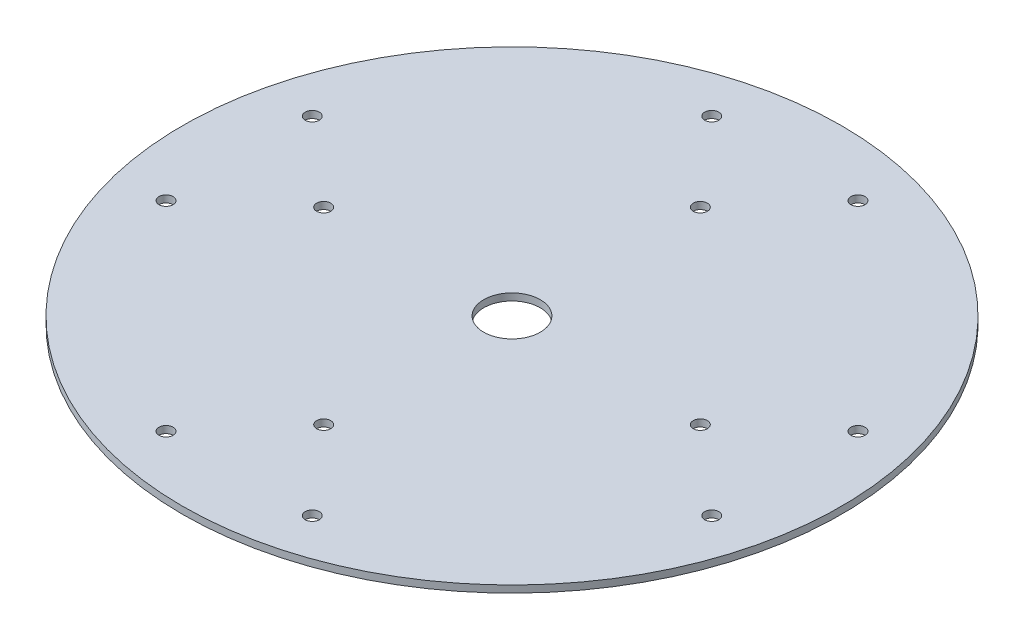
ISO-10303-21;
HEADER;
FILE_DESCRIPTION(('STEP AP214'),'2;1');
FILE_NAME('part.step','',(''),(''),'','','');
FILE_SCHEMA(('AUTOMOTIVE_DESIGN { 1 0 10303 214 1 1 1 1 }'));
ENDSEC;
DATA;
#1=APPLICATION_CONTEXT('core data for automotive mechanical design processes');
#2=APPLICATION_PROTOCOL_DEFINITION('international standard','automotive_design',2000,#1);
#3=PRODUCT_CONTEXT('',#1,'mechanical');
#4=PRODUCT('Part','Part','',(#3));
#5=PRODUCT_RELATED_PRODUCT_CATEGORY('part','',(#4));
#6=PRODUCT_DEFINITION_FORMATION('','',#4);
#7=PRODUCT_DEFINITION_CONTEXT('part definition',#1,'design');
#8=PRODUCT_DEFINITION('design','',#6,#7);
#9=PRODUCT_DEFINITION_SHAPE('','',#8);
#10=(LENGTH_UNIT() NAMED_UNIT(*) SI_UNIT(.MILLI.,.METRE.));
#11=(NAMED_UNIT(*) PLANE_ANGLE_UNIT() SI_UNIT($,.RADIAN.));
#12=(NAMED_UNIT(*) SI_UNIT($,.STERADIAN.) SOLID_ANGLE_UNIT());
#13=UNCERTAINTY_MEASURE_WITH_UNIT(LENGTH_MEASURE(1.E-05),#10,'distance_accuracy_value','');
#14=(GEOMETRIC_REPRESENTATION_CONTEXT(3) GLOBAL_UNCERTAINTY_ASSIGNED_CONTEXT((#13)) GLOBAL_UNIT_ASSIGNED_CONTEXT((#10,
#11,#12)) REPRESENTATION_CONTEXT('',''));
#15=CARTESIAN_POINT('',(0.,0.,0.));
#16=DIRECTION('',(0.,0.,1.));
#17=DIRECTION('',(1.,0.,0.));
#18=AXIS2_PLACEMENT_3D('',#15,#16,#17);
#19=CARTESIAN_POINT('',(0.,1.5,0.));
#20=DIRECTION('',(0.,1.,0.));
#21=DIRECTION('',(0.,0.,1.));
#22=AXIS2_PLACEMENT_3D('',#19,#20,#21);
#23=PLANE('',#22);
#24=CARTESIAN_POINT('',(-57.9555495773429,1.5,15.5291427061524));
#25=DIRECTION('',(0.,1.,0.));
#26=DIRECTION('',(0.,0.,1.));
#27=AXIS2_PLACEMENT_3D('',#24,#25,#26);
#28=CIRCLE('',#27,1.5);
#29=CARTESIAN_POINT('',(-57.9555495773429,1.5,17.0291427061524));
#30=VERTEX_POINT('',#29);
#31=EDGE_CURVE('E141',#30,#30,#28,.T.);
#32=ORIENTED_EDGE('',*,*,#31,.F.);
#33=EDGE_LOOP('',(#32));
#34=FACE_BOUND('',#33,.T.);
#35=CARTESIAN_POINT('',(-15.5291427061486,1.5,57.9555495773442));
#36=DIRECTION('',(0.,1.,0.));
#37=DIRECTION('',(0.,0.,1.));
#38=AXIS2_PLACEMENT_3D('',#35,#36,#37);
#39=CIRCLE('',#38,1.5);
#40=CARTESIAN_POINT('',(-15.5291427061486,1.5,59.4555495773442));
#41=VERTEX_POINT('',#40);
#42=EDGE_CURVE('E125',#41,#41,#39,.T.);
#43=ORIENTED_EDGE('',*,*,#42,.F.);
#44=EDGE_LOOP('',(#43));
#45=FACE_BOUND('',#44,.T.);
#46=CARTESIAN_POINT('',(2.25904099284255E-12,1.5,40.));
#47=DIRECTION('',(0.,1.,0.));
#48=DIRECTION('',(0.,0.,1.));
#49=AXIS2_PLACEMENT_3D('',#46,#47,#48);
#50=CIRCLE('',#49,1.5);
#51=CARTESIAN_POINT('',(2.25904099284255E-12,1.5,41.5));
#52=VERTEX_POINT('',#51);
#53=EDGE_CURVE('E109',#52,#52,#50,.T.);
#54=ORIENTED_EDGE('',*,*,#53,.F.);
#55=EDGE_LOOP('',(#54));
#56=FACE_BOUND('',#55,.T.);
#57=CARTESIAN_POINT('',(57.9555495773452,1.5,-15.5291427061524));
#58=DIRECTION('',(0.,1.,0.));
#59=DIRECTION('',(0.,0.,1.));
#60=AXIS2_PLACEMENT_3D('',#57,#58,#59);
#61=CIRCLE('',#60,1.5);
#62=CARTESIAN_POINT('',(57.9555495773452,1.5,-14.0291427061524));
#63=VERTEX_POINT('',#62);
#64=EDGE_CURVE('E93',#63,#63,#61,.T.);
#65=ORIENTED_EDGE('',*,*,#64,.F.);
#66=EDGE_LOOP('',(#65));
#67=FACE_BOUND('',#66,.T.);
#68=CARTESIAN_POINT('',(15.5291427061509,1.5,-57.9555495773442));
#69=DIRECTION('',(0.,1.,0.));
#70=DIRECTION('',(0.,0.,1.));
#71=AXIS2_PLACEMENT_3D('',#68,#69,#70);
#72=CIRCLE('',#71,1.5);
#73=CARTESIAN_POINT('',(15.5291427061509,1.5,-56.4555495773442));
#74=VERTEX_POINT('',#73);
#75=EDGE_CURVE('E77',#74,#74,#72,.T.);
#76=ORIENTED_EDGE('',*,*,#75,.F.);
#77=EDGE_LOOP('',(#76));
#78=FACE_BOUND('',#77,.T.);
#79=CARTESIAN_POINT('',(0.,1.5,-40.));
#80=DIRECTION('',(0.,1.,0.));
#81=DIRECTION('',(0.,0.,1.));
#82=AXIS2_PLACEMENT_3D('',#79,#80,#81);
#83=CIRCLE('',#82,1.5);
#84=CARTESIAN_POINT('',(0.,1.5,-38.5));
#85=VERTEX_POINT('',#84);
#86=EDGE_CURVE('E61',#85,#85,#83,.T.);
#87=ORIENTED_EDGE('',*,*,#86,.F.);
#88=EDGE_LOOP('',(#87));
#89=FACE_BOUND('',#88,.T.);
#90=CARTESIAN_POINT('',(0.,1.5,0.));
#91=DIRECTION('',(0.,1.,0.));
#92=DIRECTION('',(0.,0.,1.));
#93=AXIS2_PLACEMENT_3D('',#90,#91,#92);
#94=CIRCLE('',#93,70.);
#95=CARTESIAN_POINT('',(0.,1.5,70.));
#96=VERTEX_POINT('',#95);
#97=EDGE_CURVE('E10',#96,#96,#94,.T.);
#98=ORIENTED_EDGE('',*,*,#97,.T.);
#99=EDGE_LOOP('',(#98));
#100=FACE_BOUND('',#99,.T.);
#101=CARTESIAN_POINT('',(0.,1.5,0.));
#102=DIRECTION('',(0.,1.,0.));
#103=DIRECTION('',(0.,0.,1.));
#104=AXIS2_PLACEMENT_3D('',#101,#102,#103);
#105=CIRCLE('',#104,6.);
#106=CARTESIAN_POINT('',(0.,1.5,6.));
#107=VERTEX_POINT('',#106);
#108=EDGE_CURVE('E55',#107,#107,#105,.T.);
#109=ORIENTED_EDGE('',*,*,#108,.F.);
#110=EDGE_LOOP('',(#109));
#111=FACE_BOUND('',#110,.T.);
#112=CARTESIAN_POINT('',(-15.5291427061513,1.5,-57.9555495773441));
#113=DIRECTION('',(0.,1.,0.));
#114=DIRECTION('',(0.,0.,1.));
#115=AXIS2_PLACEMENT_3D('',#112,#113,#114);
#116=CIRCLE('',#115,1.5);
#117=CARTESIAN_POINT('',(-15.5291427061513,1.5,-56.4555495773441));
#118=VERTEX_POINT('',#117);
#119=EDGE_CURVE('E69',#118,#118,#116,.T.);
#120=ORIENTED_EDGE('',*,*,#119,.F.);
#121=EDGE_LOOP('',(#120));
#122=FACE_BOUND('',#121,.T.);
#123=CARTESIAN_POINT('',(40.0000000000011,1.5,-1.12952049642128E-12));
#124=DIRECTION('',(0.,1.,0.));
#125=DIRECTION('',(0.,0.,1.));
#126=AXIS2_PLACEMENT_3D('',#123,#124,#125);
#127=CIRCLE('',#126,1.5);
#128=CARTESIAN_POINT('',(40.0000000000011,1.5,1.49999999999887));
#129=VERTEX_POINT('',#128);
#130=EDGE_CURVE('E85',#129,#129,#127,.T.);
#131=ORIENTED_EDGE('',*,*,#130,.F.);
#132=EDGE_LOOP('',(#131));
#133=FACE_BOUND('',#132,.T.);
#134=CARTESIAN_POINT('',(57.9555495773453,1.5,15.5291427061497));
#135=DIRECTION('',(0.,1.,0.));
#136=DIRECTION('',(0.,0.,1.));
#137=AXIS2_PLACEMENT_3D('',#134,#135,#136);
#138=CIRCLE('',#137,1.5);
#139=CARTESIAN_POINT('',(57.9555495773453,1.5,17.0291427061497));
#140=VERTEX_POINT('',#139);
#141=EDGE_CURVE('E101',#140,#140,#138,.T.);
#142=ORIENTED_EDGE('',*,*,#141,.F.);
#143=EDGE_LOOP('',(#142));
#144=FACE_BOUND('',#143,.T.);
#145=CARTESIAN_POINT('',(15.5291427061536,1.5,57.9555495773441));
#146=DIRECTION('',(0.,1.,0.));
#147=DIRECTION('',(0.,0.,1.));
#148=AXIS2_PLACEMENT_3D('',#145,#146,#147);
#149=CIRCLE('',#148,1.5);
#150=CARTESIAN_POINT('',(15.5291427061536,1.5,59.4555495773441));
#151=VERTEX_POINT('',#150);
#152=EDGE_CURVE('E117',#151,#151,#149,.T.);
#153=ORIENTED_EDGE('',*,*,#152,.F.);
#154=EDGE_LOOP('',(#153));
#155=FACE_BOUND('',#154,.T.);
#156=CARTESIAN_POINT('',(-39.9999999999989,1.5,1.13441908361787E-12));
#157=DIRECTION('',(0.,1.,0.));
#158=DIRECTION('',(0.,0.,1.));
#159=AXIS2_PLACEMENT_3D('',#156,#157,#158);
#160=CIRCLE('',#159,1.5);
#161=CARTESIAN_POINT('',(-39.9999999999989,1.5,1.50000000000114));
#162=VERTEX_POINT('',#161);
#163=EDGE_CURVE('E133',#162,#162,#160,.T.);
#164=ORIENTED_EDGE('',*,*,#163,.F.);
#165=EDGE_LOOP('',(#164));
#166=FACE_BOUND('',#165,.T.);
#167=CARTESIAN_POINT('',(-57.9555495773431,1.5,-15.5291427061497));
#168=DIRECTION('',(0.,1.,0.));
#169=DIRECTION('',(0.,0.,1.));
#170=AXIS2_PLACEMENT_3D('',#167,#168,#169);
#171=CIRCLE('',#170,1.5);
#172=CARTESIAN_POINT('',(-57.9555495773431,1.5,-14.0291427061497));
#173=VERTEX_POINT('',#172);
#174=EDGE_CURVE('E149',#173,#173,#171,.T.);
#175=ORIENTED_EDGE('',*,*,#174,.F.);
#176=EDGE_LOOP('',(#175));
#177=FACE_BOUND('',#176,.T.);
#178=ADVANCED_FACE('F41',(#34,#45,#56,#67,#78,#89,#100,#111,#122,#133,#144,#155,#166,#177),#23,.T.);
#179=CARTESIAN_POINT('',(0.,0.,0.));
#180=DIRECTION('',(0.,1.,0.));
#181=DIRECTION('',(0.,0.,1.));
#182=AXIS2_PLACEMENT_3D('',#179,#180,#181);
#183=PLANE('',#182);
#184=CARTESIAN_POINT('',(0.,0.,0.));
#185=DIRECTION('',(0.,1.,0.));
#186=DIRECTION('',(0.,0.,1.));
#187=AXIS2_PLACEMENT_3D('',#184,#185,#186);
#188=CIRCLE('',#187,70.);
#189=CARTESIAN_POINT('',(0.,0.,70.));
#190=VERTEX_POINT('',#189);
#191=EDGE_CURVE('E45',#190,#190,#188,.T.);
#192=ORIENTED_EDGE('',*,*,#191,.F.);
#193=EDGE_LOOP('',(#192));
#194=FACE_BOUND('',#193,.T.);
#195=CARTESIAN_POINT('',(0.,0.,0.));
#196=DIRECTION('',(0.,1.,0.));
#197=DIRECTION('',(0.,0.,1.));
#198=AXIS2_PLACEMENT_3D('',#195,#196,#197);
#199=CIRCLE('',#198,6.);
#200=CARTESIAN_POINT('',(0.,0.,6.));
#201=VERTEX_POINT('',#200);
#202=EDGE_CURVE('E57',#201,#201,#199,.T.);
#203=ORIENTED_EDGE('',*,*,#202,.T.);
#204=EDGE_LOOP('',(#203));
#205=FACE_BOUND('',#204,.T.);
#206=CARTESIAN_POINT('',(0.,0.,-40.));
#207=DIRECTION('',(0.,1.,0.));
#208=DIRECTION('',(0.,0.,1.));
#209=AXIS2_PLACEMENT_3D('',#206,#207,#208);
#210=CIRCLE('',#209,1.5);
#211=CARTESIAN_POINT('',(0.,0.,-38.5));
#212=VERTEX_POINT('',#211);
#213=EDGE_CURVE('E65',#212,#212,#210,.T.);
#214=ORIENTED_EDGE('',*,*,#213,.T.);
#215=EDGE_LOOP('',(#214));
#216=FACE_BOUND('',#215,.T.);
#217=CARTESIAN_POINT('',(-15.5291427061513,0.,-57.9555495773441));
#218=DIRECTION('',(0.,1.,0.));
#219=DIRECTION('',(0.,0.,1.));
#220=AXIS2_PLACEMENT_3D('',#217,#218,#219);
#221=CIRCLE('',#220,1.5);
#222=CARTESIAN_POINT('',(-15.5291427061513,0.,-56.4555495773441));
#223=VERTEX_POINT('',#222);
#224=EDGE_CURVE('E73',#223,#223,#221,.T.);
#225=ORIENTED_EDGE('',*,*,#224,.T.);
#226=EDGE_LOOP('',(#225));
#227=FACE_BOUND('',#226,.T.);
#228=CARTESIAN_POINT('',(15.5291427061509,0.,-57.9555495773442));
#229=DIRECTION('',(0.,1.,0.));
#230=DIRECTION('',(0.,0.,1.));
#231=AXIS2_PLACEMENT_3D('',#228,#229,#230);
#232=CIRCLE('',#231,1.5);
#233=CARTESIAN_POINT('',(15.5291427061509,0.,-56.4555495773442));
#234=VERTEX_POINT('',#233);
#235=EDGE_CURVE('E81',#234,#234,#232,.T.);
#236=ORIENTED_EDGE('',*,*,#235,.T.);
#237=EDGE_LOOP('',(#236));
#238=FACE_BOUND('',#237,.T.);
#239=CARTESIAN_POINT('',(40.0000000000011,0.,-1.12952049642128E-12));
#240=DIRECTION('',(0.,1.,0.));
#241=DIRECTION('',(0.,0.,1.));
#242=AXIS2_PLACEMENT_3D('',#239,#240,#241);
#243=CIRCLE('',#242,1.5);
#244=CARTESIAN_POINT('',(40.0000000000011,0.,1.49999999999887));
#245=VERTEX_POINT('',#244);
#246=EDGE_CURVE('E89',#245,#245,#243,.T.);
#247=ORIENTED_EDGE('',*,*,#246,.T.);
#248=EDGE_LOOP('',(#247));
#249=FACE_BOUND('',#248,.T.);
#250=CARTESIAN_POINT('',(57.9555495773452,0.,-15.5291427061524));
#251=DIRECTION('',(0.,1.,0.));
#252=DIRECTION('',(0.,0.,1.));
#253=AXIS2_PLACEMENT_3D('',#250,#251,#252);
#254=CIRCLE('',#253,1.5);
#255=CARTESIAN_POINT('',(57.9555495773452,0.,-14.0291427061524));
#256=VERTEX_POINT('',#255);
#257=EDGE_CURVE('E97',#256,#256,#254,.T.);
#258=ORIENTED_EDGE('',*,*,#257,.T.);
#259=EDGE_LOOP('',(#258));
#260=FACE_BOUND('',#259,.T.);
#261=CARTESIAN_POINT('',(57.9555495773453,0.,15.5291427061497));
#262=DIRECTION('',(0.,1.,0.));
#263=DIRECTION('',(0.,0.,1.));
#264=AXIS2_PLACEMENT_3D('',#261,#262,#263);
#265=CIRCLE('',#264,1.5);
#266=CARTESIAN_POINT('',(57.9555495773453,0.,17.0291427061497));
#267=VERTEX_POINT('',#266);
#268=EDGE_CURVE('E105',#267,#267,#265,.T.);
#269=ORIENTED_EDGE('',*,*,#268,.T.);
#270=EDGE_LOOP('',(#269));
#271=FACE_BOUND('',#270,.T.);
#272=CARTESIAN_POINT('',(2.25904099284255E-12,0.,40.));
#273=DIRECTION('',(0.,1.,0.));
#274=DIRECTION('',(0.,0.,1.));
#275=AXIS2_PLACEMENT_3D('',#272,#273,#274);
#276=CIRCLE('',#275,1.5);
#277=CARTESIAN_POINT('',(2.25904099284255E-12,0.,41.5));
#278=VERTEX_POINT('',#277);
#279=EDGE_CURVE('E113',#278,#278,#276,.T.);
#280=ORIENTED_EDGE('',*,*,#279,.T.);
#281=EDGE_LOOP('',(#280));
#282=FACE_BOUND('',#281,.T.);
#283=CARTESIAN_POINT('',(15.5291427061536,0.,57.9555495773441));
#284=DIRECTION('',(0.,1.,0.));
#285=DIRECTION('',(0.,0.,1.));
#286=AXIS2_PLACEMENT_3D('',#283,#284,#285);
#287=CIRCLE('',#286,1.5);
#288=CARTESIAN_POINT('',(15.5291427061536,0.,59.4555495773441));
#289=VERTEX_POINT('',#288);
#290=EDGE_CURVE('E121',#289,#289,#287,.T.);
#291=ORIENTED_EDGE('',*,*,#290,.T.);
#292=EDGE_LOOP('',(#291));
#293=FACE_BOUND('',#292,.T.);
#294=CARTESIAN_POINT('',(-15.5291427061486,0.,57.9555495773442));
#295=DIRECTION('',(0.,1.,0.));
#296=DIRECTION('',(0.,0.,1.));
#297=AXIS2_PLACEMENT_3D('',#294,#295,#296);
#298=CIRCLE('',#297,1.5);
#299=CARTESIAN_POINT('',(-15.5291427061486,0.,59.4555495773442));
#300=VERTEX_POINT('',#299);
#301=EDGE_CURVE('E129',#300,#300,#298,.T.);
#302=ORIENTED_EDGE('',*,*,#301,.T.);
#303=EDGE_LOOP('',(#302));
#304=FACE_BOUND('',#303,.T.);
#305=CARTESIAN_POINT('',(-39.9999999999989,0.,1.13441908361787E-12));
#306=DIRECTION('',(0.,1.,0.));
#307=DIRECTION('',(0.,0.,1.));
#308=AXIS2_PLACEMENT_3D('',#305,#306,#307);
#309=CIRCLE('',#308,1.5);
#310=CARTESIAN_POINT('',(-39.9999999999989,0.,1.50000000000114));
#311=VERTEX_POINT('',#310);
#312=EDGE_CURVE('E137',#311,#311,#309,.T.);
#313=ORIENTED_EDGE('',*,*,#312,.T.);
#314=EDGE_LOOP('',(#313));
#315=FACE_BOUND('',#314,.T.);
#316=CARTESIAN_POINT('',(-57.9555495773429,0.,15.5291427061524));
#317=DIRECTION('',(0.,1.,0.));
#318=DIRECTION('',(0.,0.,1.));
#319=AXIS2_PLACEMENT_3D('',#316,#317,#318);
#320=CIRCLE('',#319,1.5);
#321=CARTESIAN_POINT('',(-57.9555495773429,0.,17.0291427061524));
#322=VERTEX_POINT('',#321);
#323=EDGE_CURVE('E145',#322,#322,#320,.T.);
#324=ORIENTED_EDGE('',*,*,#323,.T.);
#325=EDGE_LOOP('',(#324));
#326=FACE_BOUND('',#325,.T.);
#327=CARTESIAN_POINT('',(-57.9555495773431,0.,-15.5291427061497));
#328=DIRECTION('',(0.,1.,0.));
#329=DIRECTION('',(0.,0.,1.));
#330=AXIS2_PLACEMENT_3D('',#327,#328,#329);
#331=CIRCLE('',#330,1.5);
#332=CARTESIAN_POINT('',(-57.9555495773431,0.,-14.0291427061497));
#333=VERTEX_POINT('',#332);
#334=EDGE_CURVE('E153',#333,#333,#331,.T.);
#335=ORIENTED_EDGE('',*,*,#334,.T.);
#336=EDGE_LOOP('',(#335));
#337=FACE_BOUND('',#336,.T.);
#338=ADVANCED_FACE('F166',(#194,#205,#216,#227,#238,#249,#260,#271,#282,#293,#304,#315,#326,
#337),#183,.F.);
#339=CARTESIAN_POINT('',(0.,1.5,0.));
#340=DIRECTION('',(0.,-1.,0.));
#341=DIRECTION('',(0.,0.,-1.));
#342=AXIS2_PLACEMENT_3D('',#339,#340,#341);
#343=CYLINDRICAL_SURFACE('',#342,70.);
#344=ORIENTED_EDGE('',*,*,#97,.F.);
#345=EDGE_LOOP('',(#344));
#346=FACE_BOUND('',#345,.T.);
#347=ORIENTED_EDGE('',*,*,#191,.T.);
#348=EDGE_LOOP('',(#347));
#349=FACE_BOUND('',#348,.T.);
#350=ADVANCED_FACE('F43',(#346,#349),#343,.T.);
#351=CARTESIAN_POINT('',(0.,1.5,0.));
#352=DIRECTION('',(0.,-1.,0.));
#353=DIRECTION('',(0.,0.,-1.));
#354=AXIS2_PLACEMENT_3D('',#351,#352,#353);
#355=CYLINDRICAL_SURFACE('',#354,6.);
#356=ORIENTED_EDGE('',*,*,#108,.T.);
#357=EDGE_LOOP('',(#356));
#358=FACE_BOUND('',#357,.T.);
#359=ORIENTED_EDGE('',*,*,#202,.F.);
#360=EDGE_LOOP('',(#359));
#361=FACE_BOUND('',#360,.T.);
#362=ADVANCED_FACE('F176',(#358,#361),#355,.F.);
#363=CARTESIAN_POINT('',(0.,1.5,-40.));
#364=DIRECTION('',(0.,-1.,0.));
#365=DIRECTION('',(0.,0.,-1.));
#366=AXIS2_PLACEMENT_3D('',#363,#364,#365);
#367=CYLINDRICAL_SURFACE('',#366,1.5);
#368=ORIENTED_EDGE('',*,*,#86,.T.);
#369=EDGE_LOOP('',(#368));
#370=FACE_BOUND('',#369,.T.);
#371=ORIENTED_EDGE('',*,*,#213,.F.);
#372=EDGE_LOOP('',(#371));
#373=FACE_BOUND('',#372,.T.);
#374=ADVANCED_FACE('F179',(#370,#373),#367,.F.);
#375=CARTESIAN_POINT('',(-15.5291427061513,1.5,-57.9555495773441));
#376=DIRECTION('',(0.,-1.,0.));
#377=DIRECTION('',(0.,0.,-1.));
#378=AXIS2_PLACEMENT_3D('',#375,#376,#377);
#379=CYLINDRICAL_SURFACE('',#378,1.5);
#380=ORIENTED_EDGE('',*,*,#119,.T.);
#381=EDGE_LOOP('',(#380));
#382=FACE_BOUND('',#381,.T.);
#383=ORIENTED_EDGE('',*,*,#224,.F.);
#384=EDGE_LOOP('',(#383));
#385=FACE_BOUND('',#384,.T.);
#386=ADVANCED_FACE('F183',(#382,#385),#379,.F.);
#387=CARTESIAN_POINT('',(15.5291427061509,1.5,-57.9555495773442));
#388=DIRECTION('',(0.,-1.,0.));
#389=DIRECTION('',(0.,0.,-1.));
#390=AXIS2_PLACEMENT_3D('',#387,#388,#389);
#391=CYLINDRICAL_SURFACE('',#390,1.5);
#392=ORIENTED_EDGE('',*,*,#75,.T.);
#393=EDGE_LOOP('',(#392));
#394=FACE_BOUND('',#393,.T.);
#395=ORIENTED_EDGE('',*,*,#235,.F.);
#396=EDGE_LOOP('',(#395));
#397=FACE_BOUND('',#396,.T.);
#398=ADVANCED_FACE('F187',(#394,#397),#391,.F.);
#399=CARTESIAN_POINT('',(40.0000000000011,1.5,-1.12952049642128E-12));
#400=DIRECTION('',(0.,-1.,0.));
#401=DIRECTION('',(0.,0.,-1.));
#402=AXIS2_PLACEMENT_3D('',#399,#400,#401);
#403=CYLINDRICAL_SURFACE('',#402,1.5);
#404=ORIENTED_EDGE('',*,*,#130,.T.);
#405=EDGE_LOOP('',(#404));
#406=FACE_BOUND('',#405,.T.);
#407=ORIENTED_EDGE('',*,*,#246,.F.);
#408=EDGE_LOOP('',(#407));
#409=FACE_BOUND('',#408,.T.);
#410=ADVANCED_FACE('F191',(#406,#409),#403,.F.);
#411=CARTESIAN_POINT('',(57.9555495773452,1.5,-15.5291427061524));
#412=DIRECTION('',(0.,-1.,0.));
#413=DIRECTION('',(0.,0.,-1.));
#414=AXIS2_PLACEMENT_3D('',#411,#412,#413);
#415=CYLINDRICAL_SURFACE('',#414,1.5);
#416=ORIENTED_EDGE('',*,*,#64,.T.);
#417=EDGE_LOOP('',(#416));
#418=FACE_BOUND('',#417,.T.);
#419=ORIENTED_EDGE('',*,*,#257,.F.);
#420=EDGE_LOOP('',(#419));
#421=FACE_BOUND('',#420,.T.);
#422=ADVANCED_FACE('F195',(#418,#421),#415,.F.);
#423=CARTESIAN_POINT('',(57.9555495773453,1.5,15.5291427061497));
#424=DIRECTION('',(0.,-1.,0.));
#425=DIRECTION('',(0.,0.,-1.));
#426=AXIS2_PLACEMENT_3D('',#423,#424,#425);
#427=CYLINDRICAL_SURFACE('',#426,1.5);
#428=ORIENTED_EDGE('',*,*,#141,.T.);
#429=EDGE_LOOP('',(#428));
#430=FACE_BOUND('',#429,.T.);
#431=ORIENTED_EDGE('',*,*,#268,.F.);
#432=EDGE_LOOP('',(#431));
#433=FACE_BOUND('',#432,.T.);
#434=ADVANCED_FACE('F199',(#430,#433),#427,.F.);
#435=CARTESIAN_POINT('',(2.25904099284255E-12,1.5,40.));
#436=DIRECTION('',(0.,-1.,0.));
#437=DIRECTION('',(0.,0.,-1.));
#438=AXIS2_PLACEMENT_3D('',#435,#436,#437);
#439=CYLINDRICAL_SURFACE('',#438,1.5);
#440=ORIENTED_EDGE('',*,*,#53,.T.);
#441=EDGE_LOOP('',(#440));
#442=FACE_BOUND('',#441,.T.);
#443=ORIENTED_EDGE('',*,*,#279,.F.);
#444=EDGE_LOOP('',(#443));
#445=FACE_BOUND('',#444,.T.);
#446=ADVANCED_FACE('F203',(#442,#445),#439,.F.);
#447=CARTESIAN_POINT('',(15.5291427061536,1.5,57.9555495773441));
#448=DIRECTION('',(0.,-1.,0.));
#449=DIRECTION('',(0.,0.,-1.));
#450=AXIS2_PLACEMENT_3D('',#447,#448,#449);
#451=CYLINDRICAL_SURFACE('',#450,1.5);
#452=ORIENTED_EDGE('',*,*,#152,.T.);
#453=EDGE_LOOP('',(#452));
#454=FACE_BOUND('',#453,.T.);
#455=ORIENTED_EDGE('',*,*,#290,.F.);
#456=EDGE_LOOP('',(#455));
#457=FACE_BOUND('',#456,.T.);
#458=ADVANCED_FACE('F207',(#454,#457),#451,.F.);
#459=CARTESIAN_POINT('',(-15.5291427061486,1.5,57.9555495773442));
#460=DIRECTION('',(0.,-1.,0.));
#461=DIRECTION('',(0.,0.,-1.));
#462=AXIS2_PLACEMENT_3D('',#459,#460,#461);
#463=CYLINDRICAL_SURFACE('',#462,1.5);
#464=ORIENTED_EDGE('',*,*,#42,.T.);
#465=EDGE_LOOP('',(#464));
#466=FACE_BOUND('',#465,.T.);
#467=ORIENTED_EDGE('',*,*,#301,.F.);
#468=EDGE_LOOP('',(#467));
#469=FACE_BOUND('',#468,.T.);
#470=ADVANCED_FACE('F211',(#466,#469),#463,.F.);
#471=CARTESIAN_POINT('',(-39.9999999999989,1.5,1.13441908361787E-12));
#472=DIRECTION('',(0.,-1.,0.));
#473=DIRECTION('',(0.,0.,-1.));
#474=AXIS2_PLACEMENT_3D('',#471,#472,#473);
#475=CYLINDRICAL_SURFACE('',#474,1.5);
#476=ORIENTED_EDGE('',*,*,#163,.T.);
#477=EDGE_LOOP('',(#476));
#478=FACE_BOUND('',#477,.T.);
#479=ORIENTED_EDGE('',*,*,#312,.F.);
#480=EDGE_LOOP('',(#479));
#481=FACE_BOUND('',#480,.T.);
#482=ADVANCED_FACE('F215',(#478,#481),#475,.F.);
#483=CARTESIAN_POINT('',(-57.9555495773429,1.5,15.5291427061524));
#484=DIRECTION('',(0.,-1.,0.));
#485=DIRECTION('',(0.,0.,-1.));
#486=AXIS2_PLACEMENT_3D('',#483,#484,#485);
#487=CYLINDRICAL_SURFACE('',#486,1.5);
#488=ORIENTED_EDGE('',*,*,#31,.T.);
#489=EDGE_LOOP('',(#488));
#490=FACE_BOUND('',#489,.T.);
#491=ORIENTED_EDGE('',*,*,#323,.F.);
#492=EDGE_LOOP('',(#491));
#493=FACE_BOUND('',#492,.T.);
#494=ADVANCED_FACE('F219',(#490,#493),#487,.F.);
#495=CARTESIAN_POINT('',(-57.9555495773431,1.5,-15.5291427061497));
#496=DIRECTION('',(0.,-1.,0.));
#497=DIRECTION('',(0.,0.,-1.));
#498=AXIS2_PLACEMENT_3D('',#495,#496,#497);
#499=CYLINDRICAL_SURFACE('',#498,1.5);
#500=ORIENTED_EDGE('',*,*,#174,.T.);
#501=EDGE_LOOP('',(#500));
#502=FACE_BOUND('',#501,.T.);
#503=ORIENTED_EDGE('',*,*,#334,.F.);
#504=EDGE_LOOP('',(#503));
#505=FACE_BOUND('',#504,.T.);
#506=ADVANCED_FACE('F162',(#502,#505),#499,.F.);
#507=CLOSED_SHELL('',(#178,#338,#350,#362,#374,#386,#398,#410,#422,#434,#446,#458,#470,#482,
#494,#506));
#508=MANIFOLD_SOLID_BREP('B2',#507);
#509=ADVANCED_BREP_SHAPE_REPRESENTATION('',(#18,#508),#14);
#510=SHAPE_DEFINITION_REPRESENTATION(#9,#509);
ENDSEC;
END-ISO-10303-21;
